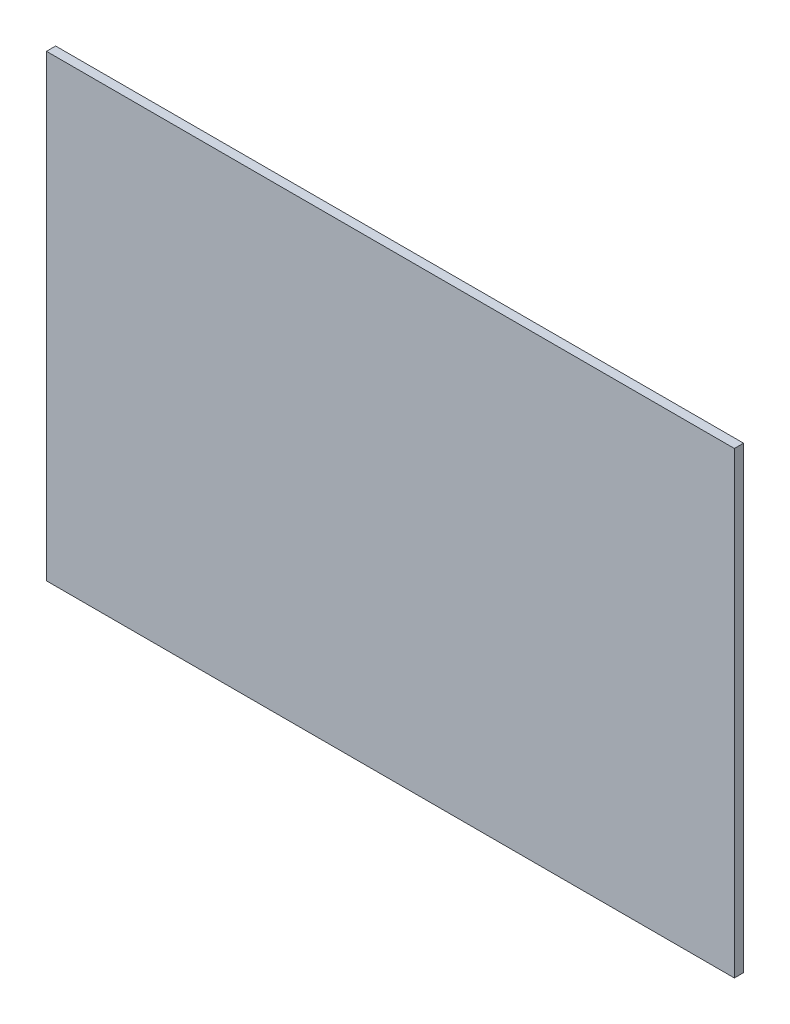
ISO-10303-21;
HEADER;
FILE_DESCRIPTION(('STEP AP214'),'2;1');
FILE_NAME('part.step','',(''),(''),'','','');
FILE_SCHEMA(('AUTOMOTIVE_DESIGN { 1 0 10303 214 1 1 1 1 }'));
ENDSEC;
DATA;
#1=APPLICATION_CONTEXT('core data for automotive mechanical design processes');
#2=APPLICATION_PROTOCOL_DEFINITION('international standard','automotive_design',2000,#1);
#3=PRODUCT_CONTEXT('',#1,'mechanical');
#4=PRODUCT('Part','Part','',(#3));
#5=PRODUCT_RELATED_PRODUCT_CATEGORY('part','',(#4));
#6=PRODUCT_DEFINITION_FORMATION('','',#4);
#7=PRODUCT_DEFINITION_CONTEXT('part definition',#1,'design');
#8=PRODUCT_DEFINITION('design','',#6,#7);
#9=PRODUCT_DEFINITION_SHAPE('','',#8);
#10=(LENGTH_UNIT() NAMED_UNIT(*) SI_UNIT(.MILLI.,.METRE.));
#11=(NAMED_UNIT(*) PLANE_ANGLE_UNIT() SI_UNIT($,.RADIAN.));
#12=(NAMED_UNIT(*) SI_UNIT($,.STERADIAN.) SOLID_ANGLE_UNIT());
#13=UNCERTAINTY_MEASURE_WITH_UNIT(LENGTH_MEASURE(1.E-05),#10,'distance_accuracy_value','');
#14=(GEOMETRIC_REPRESENTATION_CONTEXT(3) GLOBAL_UNCERTAINTY_ASSIGNED_CONTEXT((#13)) GLOBAL_UNIT_ASSIGNED_CONTEXT((#10,
#11,#12)) REPRESENTATION_CONTEXT('',''));
#15=CARTESIAN_POINT('',(0.,0.,0.));
#16=DIRECTION('',(0.,0.,1.));
#17=DIRECTION('',(1.,0.,0.));
#18=AXIS2_PLACEMENT_3D('',#15,#16,#17);
#19=CARTESIAN_POINT('',(-150.,100.,4.));
#20=DIRECTION('',(1.,0.,0.));
#21=DIRECTION('',(0.,1.,0.));
#22=AXIS2_PLACEMENT_3D('',#19,#20,#21);
#23=PLANE('',#22);
#24=DIRECTION('',(0.,-1.,0.));
#25=VECTOR('',#24,1.);
#26=CARTESIAN_POINT('',(-150.,100.,0.));
#27=LINE('',#26,#25);
#28=CARTESIAN_POINT('',(-150.,100.,0.));
#29=VERTEX_POINT('',#28);
#30=CARTESIAN_POINT('',(-150.,-100.,0.));
#31=VERTEX_POINT('',#30);
#32=EDGE_CURVE('E98',#29,#31,#27,.T.);
#33=ORIENTED_EDGE('',*,*,#32,.T.);
#34=DIRECTION('',(0.,0.,-1.));
#35=VECTOR('',#34,1.);
#36=CARTESIAN_POINT('',(-150.,-100.,4.));
#37=LINE('',#36,#35);
#38=CARTESIAN_POINT('',(-150.,-100.,4.));
#39=VERTEX_POINT('',#38);
#40=EDGE_CURVE('E11',#39,#31,#37,.T.);
#41=ORIENTED_EDGE('',*,*,#40,.F.);
#42=DIRECTION('',(0.,-1.,0.));
#43=VECTOR('',#42,1.);
#44=CARTESIAN_POINT('',(-150.,100.,4.));
#45=LINE('',#44,#43);
#46=CARTESIAN_POINT('',(-150.,100.,4.));
#47=VERTEX_POINT('',#46);
#48=EDGE_CURVE('E86',#47,#39,#45,.T.);
#49=ORIENTED_EDGE('',*,*,#48,.F.);
#50=DIRECTION('',(0.,0.,-1.));
#51=VECTOR('',#50,1.);
#52=CARTESIAN_POINT('',(-150.,100.,4.));
#53=LINE('',#52,#51);
#54=EDGE_CURVE('E94',#47,#29,#53,.T.);
#55=ORIENTED_EDGE('',*,*,#54,.T.);
#56=EDGE_LOOP('',(#33,#41,#49,#55));
#57=FACE_BOUND('',#56,.T.);
#58=ADVANCED_FACE('F35',(#57),#23,.F.);
#59=CARTESIAN_POINT('',(-150.,-100.,4.));
#60=DIRECTION('',(0.,1.,0.));
#61=DIRECTION('',(0.,0.,1.));
#62=AXIS2_PLACEMENT_3D('',#59,#60,#61);
#63=PLANE('',#62);
#64=DIRECTION('',(1.,0.,0.));
#65=VECTOR('',#64,1.);
#66=CARTESIAN_POINT('',(-150.,-100.,0.));
#67=LINE('',#66,#65);
#68=CARTESIAN_POINT('',(150.,-100.,0.));
#69=VERTEX_POINT('',#68);
#70=EDGE_CURVE('E90',#31,#69,#67,.T.);
#71=ORIENTED_EDGE('',*,*,#70,.T.);
#72=DIRECTION('',(0.,0.,-1.));
#73=VECTOR('',#72,1.);
#74=CARTESIAN_POINT('',(150.,-100.,4.));
#75=LINE('',#74,#73);
#76=CARTESIAN_POINT('',(150.,-100.,4.));
#77=VERTEX_POINT('',#76);
#78=EDGE_CURVE('E43',#77,#69,#75,.T.);
#79=ORIENTED_EDGE('',*,*,#78,.F.);
#80=DIRECTION('',(1.,0.,0.));
#81=VECTOR('',#80,1.);
#82=CARTESIAN_POINT('',(-150.,-100.,4.));
#83=LINE('',#82,#81);
#84=EDGE_CURVE('E81',#39,#77,#83,.T.);
#85=ORIENTED_EDGE('',*,*,#84,.F.);
#86=ORIENTED_EDGE('',*,*,#40,.T.);
#87=EDGE_LOOP('',(#71,#79,#85,#86));
#88=FACE_BOUND('',#87,.T.);
#89=ADVANCED_FACE('F89',(#88),#63,.F.);
#90=CARTESIAN_POINT('',(150.,100.,4.));
#91=DIRECTION('',(-1.,0.,0.));
#92=DIRECTION('',(0.,-1.,0.));
#93=AXIS2_PLACEMENT_3D('',#90,#91,#92);
#94=PLANE('',#93);
#95=DIRECTION('',(0.,1.,0.));
#96=VECTOR('',#95,1.);
#97=CARTESIAN_POINT('',(150.,100.,0.));
#98=LINE('',#97,#96);
#99=CARTESIAN_POINT('',(150.,100.,0.));
#100=VERTEX_POINT('',#99);
#101=EDGE_CURVE('E68',#69,#100,#98,.T.);
#102=ORIENTED_EDGE('',*,*,#101,.T.);
#103=DIRECTION('',(0.,0.,-1.));
#104=VECTOR('',#103,1.);
#105=CARTESIAN_POINT('',(150.,100.,4.));
#106=LINE('',#105,#104);
#107=CARTESIAN_POINT('',(150.,100.,4.));
#108=VERTEX_POINT('',#107);
#109=EDGE_CURVE('E91',#108,#100,#106,.T.);
#110=ORIENTED_EDGE('',*,*,#109,.F.);
#111=DIRECTION('',(0.,1.,0.));
#112=VECTOR('',#111,1.);
#113=CARTESIAN_POINT('',(150.,100.,4.));
#114=LINE('',#113,#112);
#115=EDGE_CURVE('E84',#77,#108,#114,.T.);
#116=ORIENTED_EDGE('',*,*,#115,.F.);
#117=ORIENTED_EDGE('',*,*,#78,.T.);
#118=EDGE_LOOP('',(#102,#110,#116,#117));
#119=FACE_BOUND('',#118,.T.);
#120=ADVANCED_FACE('F92',(#119),#94,.F.);
#121=CARTESIAN_POINT('',(-150.,100.,4.));
#122=DIRECTION('',(0.,-1.,0.));
#123=DIRECTION('',(0.,0.,-1.));
#124=AXIS2_PLACEMENT_3D('',#121,#122,#123);
#125=PLANE('',#124);
#126=DIRECTION('',(-1.,0.,0.));
#127=VECTOR('',#126,1.);
#128=CARTESIAN_POINT('',(-150.,100.,0.));
#129=LINE('',#128,#127);
#130=EDGE_CURVE('E74',#100,#29,#129,.T.);
#131=ORIENTED_EDGE('',*,*,#130,.T.);
#132=ORIENTED_EDGE('',*,*,#54,.F.);
#133=DIRECTION('',(-1.,0.,0.));
#134=VECTOR('',#133,1.);
#135=CARTESIAN_POINT('',(-150.,100.,4.));
#136=LINE('',#135,#134);
#137=EDGE_CURVE('E51',#108,#47,#136,.T.);
#138=ORIENTED_EDGE('',*,*,#137,.F.);
#139=ORIENTED_EDGE('',*,*,#109,.T.);
#140=EDGE_LOOP('',(#131,#132,#138,#139));
#141=FACE_BOUND('',#140,.T.);
#142=ADVANCED_FACE('F105',(#141),#125,.F.);
#143=CARTESIAN_POINT('',(0.,0.,4.));
#144=DIRECTION('',(0.,0.,1.));
#145=DIRECTION('',(1.,0.,0.));
#146=AXIS2_PLACEMENT_3D('',#143,#144,#145);
#147=PLANE('',#146);
#148=ORIENTED_EDGE('',*,*,#48,.T.);
#149=ORIENTED_EDGE('',*,*,#84,.T.);
#150=ORIENTED_EDGE('',*,*,#115,.T.);
#151=ORIENTED_EDGE('',*,*,#137,.T.);
#152=EDGE_LOOP('',(#148,#149,#150,#151));
#153=FACE_BOUND('',#152,.T.);
#154=ADVANCED_FACE('F82',(#153),#147,.T.);
#155=CARTESIAN_POINT('',(0.,0.,0.));
#156=DIRECTION('',(0.,0.,1.));
#157=DIRECTION('',(1.,0.,0.));
#158=AXIS2_PLACEMENT_3D('',#155,#156,#157);
#159=PLANE('',#158);
#160=ORIENTED_EDGE('',*,*,#32,.F.);
#161=ORIENTED_EDGE('',*,*,#130,.F.);
#162=ORIENTED_EDGE('',*,*,#101,.F.);
#163=ORIENTED_EDGE('',*,*,#70,.F.);
#164=EDGE_LOOP('',(#160,#161,#162,#163));
#165=FACE_BOUND('',#164,.T.);
#166=ADVANCED_FACE('F108',(#165),#159,.F.);
#167=CLOSED_SHELL('',(#58,#89,#120,#142,#154,#166));
#168=MANIFOLD_SOLID_BREP('B2',#167);
#169=ADVANCED_BREP_SHAPE_REPRESENTATION('',(#18,#168),#14);
#170=SHAPE_DEFINITION_REPRESENTATION(#9,#169);
ENDSEC;
END-ISO-10303-21;
